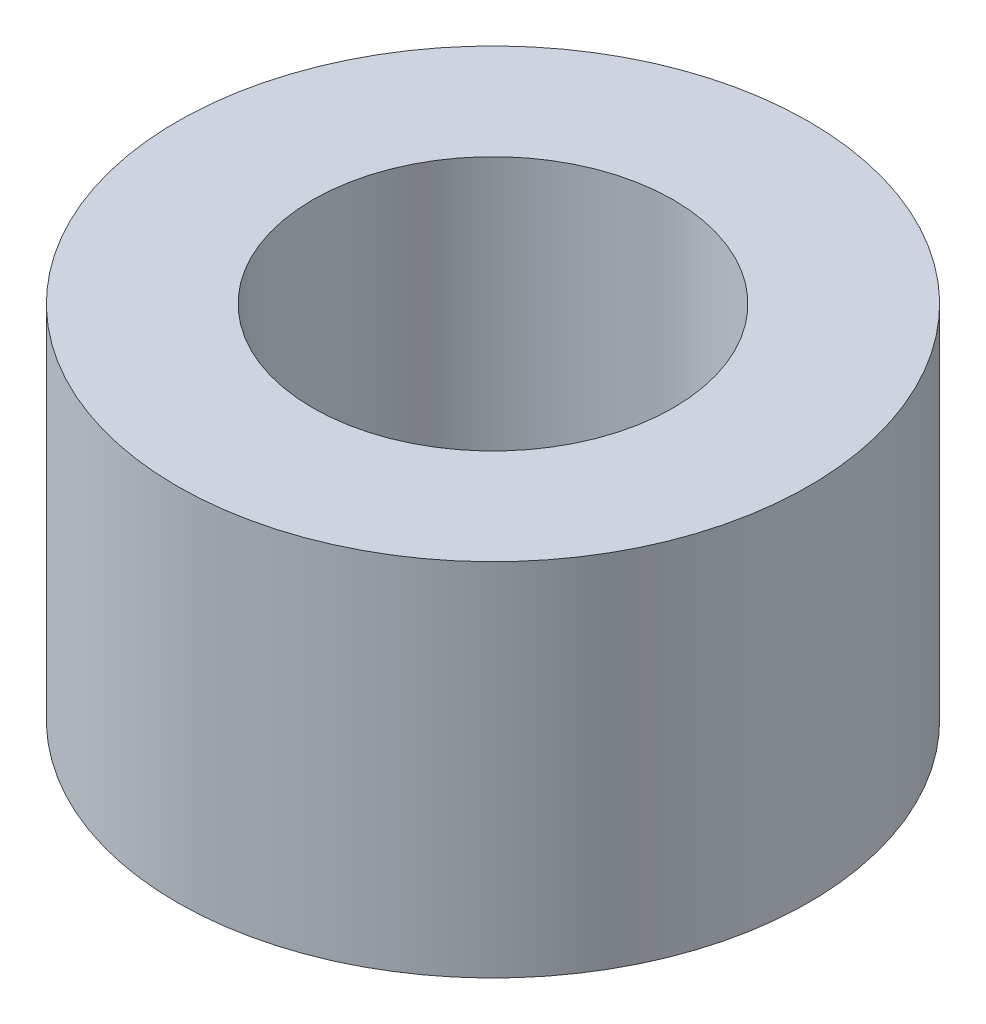
ISO-10303-21;
HEADER;
FILE_DESCRIPTION(('STEP AP214'),'2;1');
FILE_NAME('part.step','',(''),(''),'','','');
FILE_SCHEMA(('AUTOMOTIVE_DESIGN { 1 0 10303 214 1 1 1 1 }'));
ENDSEC;
DATA;
#1=APPLICATION_CONTEXT('core data for automotive mechanical design processes');
#2=APPLICATION_PROTOCOL_DEFINITION('international standard','automotive_design',2000,#1);
#3=PRODUCT_CONTEXT('',#1,'mechanical');
#4=PRODUCT('Part','Part','',(#3));
#5=PRODUCT_RELATED_PRODUCT_CATEGORY('part','',(#4));
#6=PRODUCT_DEFINITION_FORMATION('','',#4);
#7=PRODUCT_DEFINITION_CONTEXT('part definition',#1,'design');
#8=PRODUCT_DEFINITION('design','',#6,#7);
#9=PRODUCT_DEFINITION_SHAPE('','',#8);
#10=(LENGTH_UNIT() NAMED_UNIT(*) SI_UNIT(.MILLI.,.METRE.));
#11=(NAMED_UNIT(*) PLANE_ANGLE_UNIT() SI_UNIT($,.RADIAN.));
#12=(NAMED_UNIT(*) SI_UNIT($,.STERADIAN.) SOLID_ANGLE_UNIT());
#13=UNCERTAINTY_MEASURE_WITH_UNIT(LENGTH_MEASURE(1.E-05),#10,'distance_accuracy_value','');
#14=(GEOMETRIC_REPRESENTATION_CONTEXT(3) GLOBAL_UNCERTAINTY_ASSIGNED_CONTEXT((#13)) GLOBAL_UNIT_ASSIGNED_CONTEXT((#10,
#11,#12)) REPRESENTATION_CONTEXT('',''));
#15=CARTESIAN_POINT('',(0.,0.,0.));
#16=DIRECTION('',(0.,0.,1.));
#17=DIRECTION('',(1.,0.,0.));
#18=AXIS2_PLACEMENT_3D('',#15,#16,#17);
#19=CARTESIAN_POINT('',(0.,6.35,0.));
#20=DIRECTION('',(0.,-1.,0.));
#21=DIRECTION('',(0.,0.,-1.));
#22=AXIS2_PLACEMENT_3D('',#19,#20,#21);
#23=CYLINDRICAL_SURFACE('',#22,5.5626);
#24=CARTESIAN_POINT('',(0.,6.35,0.));
#25=DIRECTION('',(0.,1.,0.));
#26=DIRECTION('',(0.,0.,1.));
#27=AXIS2_PLACEMENT_3D('',#24,#25,#26);
#28=CIRCLE('',#27,5.5626);
#29=CARTESIAN_POINT('',(0.,6.35,5.5626));
#30=VERTEX_POINT('',#29);
#31=EDGE_CURVE('E10',#30,#30,#28,.T.);
#32=ORIENTED_EDGE('',*,*,#31,.F.);
#33=EDGE_LOOP('',(#32));
#34=FACE_BOUND('',#33,.T.);
#35=CARTESIAN_POINT('',(0.,0.,0.));
#36=DIRECTION('',(0.,1.,0.));
#37=DIRECTION('',(0.,0.,1.));
#38=AXIS2_PLACEMENT_3D('',#35,#36,#37);
#39=CIRCLE('',#38,5.5626);
#40=CARTESIAN_POINT('',(0.,0.,5.5626));
#41=VERTEX_POINT('',#40);
#42=EDGE_CURVE('E34',#41,#41,#39,.T.);
#43=ORIENTED_EDGE('',*,*,#42,.T.);
#44=EDGE_LOOP('',(#43));
#45=FACE_BOUND('',#44,.T.);
#46=ADVANCED_FACE('F31',(#34,#45),#23,.T.);
#47=CARTESIAN_POINT('',(0.,6.35,0.));
#48=DIRECTION('',(0.,1.,0.));
#49=DIRECTION('',(0.,0.,1.));
#50=AXIS2_PLACEMENT_3D('',#47,#48,#49);
#51=PLANE('',#50);
#52=CARTESIAN_POINT('',(0.,6.35,0.));
#53=DIRECTION('',(0.,-1.,0.));
#54=DIRECTION('',(0.,0.,-1.));
#55=AXIS2_PLACEMENT_3D('',#52,#53,#54);
#56=CIRCLE('',#55,3.175);
#57=CARTESIAN_POINT('',(0.,6.35,-3.175));
#58=VERTEX_POINT('',#57);
#59=EDGE_CURVE('E41',#58,#58,#56,.T.);
#60=ORIENTED_EDGE('',*,*,#59,.T.);
#61=EDGE_LOOP('',(#60));
#62=FACE_BOUND('',#61,.T.);
#63=ORIENTED_EDGE('',*,*,#31,.T.);
#64=EDGE_LOOP('',(#63));
#65=FACE_BOUND('',#64,.T.);
#66=ADVANCED_FACE('F49',(#62,#65),#51,.T.);
#67=CARTESIAN_POINT('',(0.,0.,0.));
#68=DIRECTION('',(0.,1.,0.));
#69=DIRECTION('',(0.,0.,1.));
#70=AXIS2_PLACEMENT_3D('',#67,#68,#69);
#71=PLANE('',#70);
#72=CARTESIAN_POINT('',(0.,0.,0.));
#73=DIRECTION('',(0.,-1.,0.));
#74=DIRECTION('',(0.,0.,-1.));
#75=AXIS2_PLACEMENT_3D('',#72,#73,#74);
#76=CIRCLE('',#75,3.175);
#77=CARTESIAN_POINT('',(0.,0.,-3.175));
#78=VERTEX_POINT('',#77);
#79=EDGE_CURVE('E43',#78,#78,#76,.T.);
#80=ORIENTED_EDGE('',*,*,#79,.F.);
#81=EDGE_LOOP('',(#80));
#82=FACE_BOUND('',#81,.T.);
#83=ORIENTED_EDGE('',*,*,#42,.F.);
#84=EDGE_LOOP('',(#83));
#85=FACE_BOUND('',#84,.T.);
#86=ADVANCED_FACE('F54',(#82,#85),#71,.F.);
#87=CARTESIAN_POINT('',(0.,6.35,0.));
#88=DIRECTION('',(0.,-1.,0.));
#89=DIRECTION('',(0.,0.,-1.));
#90=AXIS2_PLACEMENT_3D('',#87,#88,#89);
#91=CYLINDRICAL_SURFACE('',#90,3.175);
#92=ORIENTED_EDGE('',*,*,#59,.F.);
#93=EDGE_LOOP('',(#92));
#94=FACE_BOUND('',#93,.T.);
#95=ORIENTED_EDGE('',*,*,#79,.T.);
#96=EDGE_LOOP('',(#95));
#97=FACE_BOUND('',#96,.T.);
#98=ADVANCED_FACE('F51',(#94,#97),#91,.F.);
#99=CLOSED_SHELL('',(#46,#66,#86,#98));
#100=MANIFOLD_SOLID_BREP('B2',#99);
#101=ADVANCED_BREP_SHAPE_REPRESENTATION('',(#18,#100),#14);
#102=SHAPE_DEFINITION_REPRESENTATION(#9,#101);
ENDSEC;
END-ISO-10303-21;
